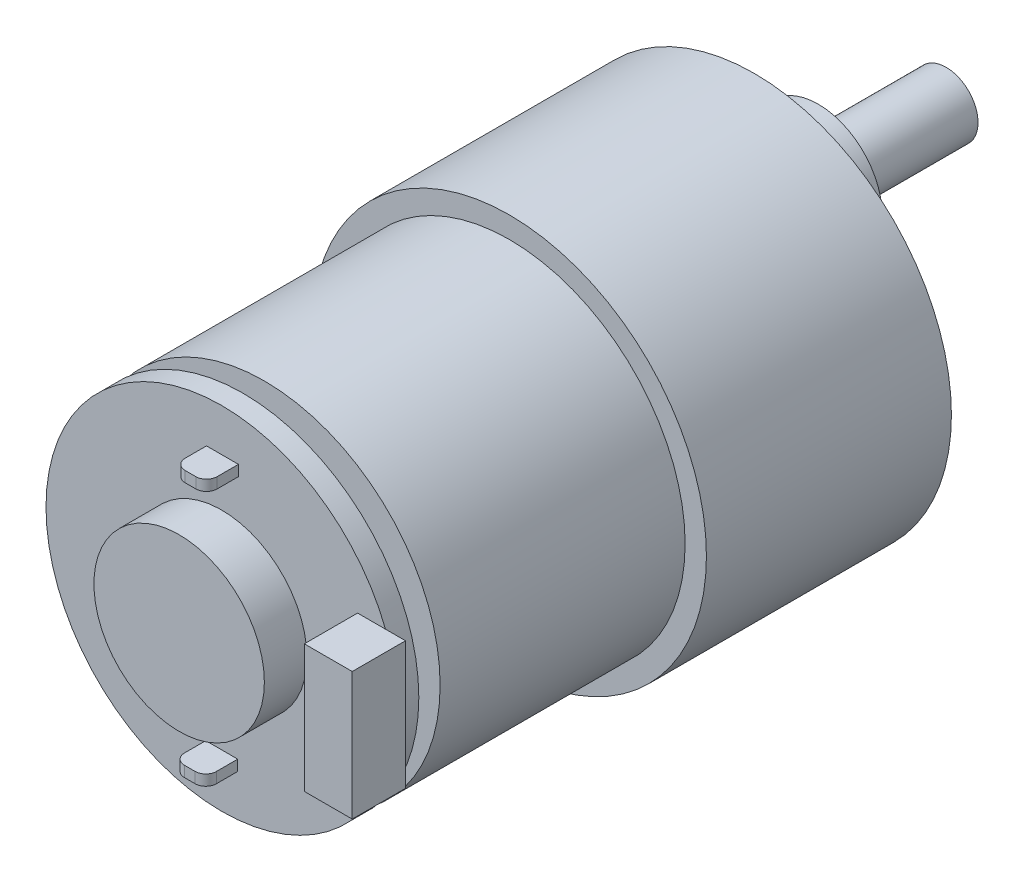
ISO-10303-21;
HEADER;
FILE_DESCRIPTION(('STEP AP214'),'2;1');
FILE_NAME('part.step','',(''),(''),'','','');
FILE_SCHEMA(('AUTOMOTIVE_DESIGN { 1 0 10303 214 1 1 1 1 }'));
ENDSEC;
DATA;
#1=APPLICATION_CONTEXT('core data for automotive mechanical design processes');
#2=APPLICATION_PROTOCOL_DEFINITION('international standard','automotive_design',2000,#1);
#3=PRODUCT_CONTEXT('',#1,'mechanical');
#4=PRODUCT('Part','Part','',(#3));
#5=PRODUCT_RELATED_PRODUCT_CATEGORY('part','',(#4));
#6=PRODUCT_DEFINITION_FORMATION('','',#4);
#7=PRODUCT_DEFINITION_CONTEXT('part definition',#1,'design');
#8=PRODUCT_DEFINITION('design','',#6,#7);
#9=PRODUCT_DEFINITION_SHAPE('','',#8);
#10=(LENGTH_UNIT() NAMED_UNIT(*) SI_UNIT(.MILLI.,.METRE.));
#11=(NAMED_UNIT(*) PLANE_ANGLE_UNIT() SI_UNIT($,.RADIAN.));
#12=(NAMED_UNIT(*) SI_UNIT($,.STERADIAN.) SOLID_ANGLE_UNIT());
#13=UNCERTAINTY_MEASURE_WITH_UNIT(LENGTH_MEASURE(1.E-05),#10,'distance_accuracy_value','');
#14=(GEOMETRIC_REPRESENTATION_CONTEXT(3) GLOBAL_UNCERTAINTY_ASSIGNED_CONTEXT((#13)) GLOBAL_UNIT_ASSIGNED_CONTEXT((#10,
#11,#12)) REPRESENTATION_CONTEXT('',''));
#15=CARTESIAN_POINT('',(0.,0.,0.));
#16=DIRECTION('',(0.,0.,1.));
#17=DIRECTION('',(1.,0.,0.));
#18=AXIS2_PLACEMENT_3D('',#15,#16,#17);
#19=CARTESIAN_POINT('',(0.,0.,50.));
#20=DIRECTION('',(0.,0.,1.));
#21=DIRECTION('',(1.,0.,0.));
#22=AXIS2_PLACEMENT_3D('',#19,#20,#21);
#23=PLANE('',#22);
#24=CARTESIAN_POINT('',(0.,0.,50.));
#25=DIRECTION('',(0.,0.,1.));
#26=DIRECTION('',(1.,0.,0.));
#27=AXIS2_PLACEMENT_3D('',#24,#25,#26);
#28=CIRCLE('',#27,8.);
#29=CARTESIAN_POINT('',(8.,0.,50.));
#30=VERTEX_POINT('',#29);
#31=EDGE_CURVE('E903',#30,#30,#28,.T.);
#32=ORIENTED_EDGE('',*,*,#31,.F.);
#33=EDGE_LOOP('',(#32));
#34=FACE_BOUND('',#33,.T.);
#35=DIRECTION('',(0.,1.,0.));
#36=VECTOR('',#35,1.);
#37=CARTESIAN_POINT('',(1.5,-11.5,50.));
#38=LINE('',#37,#36);
#39=CARTESIAN_POINT('',(1.5,-12.5,50.));
#40=VERTEX_POINT('',#39);
#41=CARTESIAN_POINT('',(1.5,-11.5,50.));
#42=VERTEX_POINT('',#41);
#43=EDGE_CURVE('E267',#40,#42,#38,.T.);
#44=ORIENTED_EDGE('',*,*,#43,.F.);
#45=DIRECTION('',(1.,0.,0.));
#46=VECTOR('',#45,1.);
#47=CARTESIAN_POINT('',(-1.5,-12.5,50.));
#48=LINE('',#47,#46);
#49=CARTESIAN_POINT('',(-1.5,-12.5,50.));
#50=VERTEX_POINT('',#49);
#51=EDGE_CURVE('E375',#50,#40,#48,.T.);
#52=ORIENTED_EDGE('',*,*,#51,.F.);
#53=DIRECTION('',(0.,-1.,0.));
#54=VECTOR('',#53,1.);
#55=CARTESIAN_POINT('',(-1.5,-11.5,50.));
#56=LINE('',#55,#54);
#57=CARTESIAN_POINT('',(-1.5,-11.5,50.));
#58=VERTEX_POINT('',#57);
#59=EDGE_CURVE('E261',#58,#50,#56,.T.);
#60=ORIENTED_EDGE('',*,*,#59,.F.);
#61=DIRECTION('',(-1.,0.,0.));
#62=VECTOR('',#61,1.);
#63=CARTESIAN_POINT('',(-1.5,-11.5,50.));
#64=LINE('',#63,#62);
#65=EDGE_CURVE('E264',#42,#58,#64,.T.);
#66=ORIENTED_EDGE('',*,*,#65,.F.);
#67=EDGE_LOOP('',(#44,#52,#60,#66));
#68=FACE_BOUND('',#67,.T.);
#69=DIRECTION('',(0.,1.,0.));
#70=VECTOR('',#69,1.);
#71=CARTESIAN_POINT('',(1.56650922654028,12.5,50.));
#72=LINE('',#71,#70);
#73=CARTESIAN_POINT('',(1.56650922654028,11.5,50.));
#74=VERTEX_POINT('',#73);
#75=CARTESIAN_POINT('',(1.56650922654028,12.5,50.));
#76=VERTEX_POINT('',#75);
#77=EDGE_CURVE('E279',#74,#76,#72,.T.);
#78=ORIENTED_EDGE('',*,*,#77,.F.);
#79=DIRECTION('',(1.,0.,0.));
#80=VECTOR('',#79,1.);
#81=CARTESIAN_POINT('',(-1.43349077345972,11.5,50.));
#82=LINE('',#81,#80);
#83=CARTESIAN_POINT('',(-1.43349077345972,11.5,50.));
#84=VERTEX_POINT('',#83);
#85=EDGE_CURVE('E270',#84,#74,#82,.T.);
#86=ORIENTED_EDGE('',*,*,#85,.F.);
#87=DIRECTION('',(0.,-1.,0.));
#88=VECTOR('',#87,1.);
#89=CARTESIAN_POINT('',(-1.43349077345972,12.5,50.));
#90=LINE('',#89,#88);
#91=CARTESIAN_POINT('',(-1.43349077345972,12.5,50.));
#92=VERTEX_POINT('',#91);
#93=EDGE_CURVE('E273',#92,#84,#90,.T.);
#94=ORIENTED_EDGE('',*,*,#93,.F.);
#95=DIRECTION('',(-1.,0.,0.));
#96=VECTOR('',#95,1.);
#97=CARTESIAN_POINT('',(-1.43349077345972,12.5,50.));
#98=LINE('',#97,#96);
#99=EDGE_CURVE('E276',#76,#92,#98,.T.);
#100=ORIENTED_EDGE('',*,*,#99,.F.);
#101=EDGE_LOOP('',(#78,#86,#94,#100));
#102=FACE_BOUND('',#101,.T.);
#103=DIRECTION('',(0.,-1.,0.));
#104=VECTOR('',#103,1.);
#105=CARTESIAN_POINT('',(12.75,6.,50.));
#106=LINE('',#105,#104);
#107=CARTESIAN_POINT('',(12.75,6.,50.));
#108=VERTEX_POINT('',#107);
#109=CARTESIAN_POINT('',(12.75,-6.,50.));
#110=VERTEX_POINT('',#109);
#111=EDGE_CURVE('E886',#108,#110,#106,.T.);
#112=ORIENTED_EDGE('',*,*,#111,.F.);
#113=DIRECTION('',(-1.,0.,0.));
#114=VECTOR('',#113,1.);
#115=CARTESIAN_POINT('',(12.75,6.,50.));
#116=LINE('',#115,#114);
#117=CARTESIAN_POINT('',(15.3704261489394,6.,50.));
#118=VERTEX_POINT('',#117);
#119=EDGE_CURVE('E898',#118,#108,#116,.T.);
#120=ORIENTED_EDGE('',*,*,#119,.F.);
#121=CARTESIAN_POINT('',(0.,0.,50.));
#122=DIRECTION('',(0.,0.,1.));
#123=DIRECTION('',(1.,0.,0.));
#124=AXIS2_PLACEMENT_3D('',#121,#122,#123);
#125=CIRCLE('',#124,16.5);
#126=CARTESIAN_POINT('',(15.3704261489394,-6.,50.));
#127=VERTEX_POINT('',#126);
#128=EDGE_CURVE('E237',#118,#127,#125,.T.);
#129=ORIENTED_EDGE('',*,*,#128,.T.);
#130=DIRECTION('',(1.,0.,0.));
#131=VECTOR('',#130,1.);
#132=CARTESIAN_POINT('',(12.75,-6.,50.));
#133=LINE('',#132,#131);
#134=EDGE_CURVE('E223',#110,#127,#133,.T.);
#135=ORIENTED_EDGE('',*,*,#134,.F.);
#136=EDGE_LOOP('',(#112,#120,#129,#135));
#137=FACE_BOUND('',#136,.T.);
#138=ADVANCED_FACE('F34',(#34,#68,#102,#137),#23,.T.);
#139=CARTESIAN_POINT('',(1.56650922654028,12.5,53.));
#140=DIRECTION('',(-1.,0.,0.));
#141=DIRECTION('',(0.,-1.,0.));
#142=AXIS2_PLACEMENT_3D('',#139,#140,#141);
#143=PLANE('',#142);
#144=DIRECTION('',(0.,1.,0.));
#145=VECTOR('',#144,1.);
#146=CARTESIAN_POINT('',(1.56650922654028,12.5,48.));
#147=LINE('',#146,#145);
#148=CARTESIAN_POINT('',(1.56650922654028,11.5,48.));
#149=VERTEX_POINT('',#148);
#150=CARTESIAN_POINT('',(1.56650922654028,12.5,48.));
#151=VERTEX_POINT('',#150);
#152=EDGE_CURVE('E258',#149,#151,#147,.T.);
#153=ORIENTED_EDGE('',*,*,#152,.F.);
#154=DIRECTION('',(0.,0.,-1.));
#155=VECTOR('',#154,1.);
#156=CARTESIAN_POINT('',(1.56650922654028,11.5,53.));
#157=LINE('',#156,#155);
#158=CARTESIAN_POINT('',(1.56650922654028,11.5,46.));
#159=VERTEX_POINT('',#158);
#160=EDGE_CURVE('E320',#149,#159,#157,.T.);
#161=ORIENTED_EDGE('',*,*,#160,.T.);
#162=DIRECTION('',(0.,1.,0.));
#163=VECTOR('',#162,1.);
#164=CARTESIAN_POINT('',(1.56650922654028,12.5,46.));
#165=LINE('',#164,#163);
#166=CARTESIAN_POINT('',(1.56650922654028,12.5,46.));
#167=VERTEX_POINT('',#166);
#168=EDGE_CURVE('E312',#159,#167,#165,.T.);
#169=ORIENTED_EDGE('',*,*,#168,.T.);
#170=DIRECTION('',(0.,0.,-1.));
#171=VECTOR('',#170,1.);
#172=CARTESIAN_POINT('',(1.56650922654028,12.5,53.));
#173=LINE('',#172,#171);
#174=EDGE_CURVE('E339',#151,#167,#173,.T.);
#175=ORIENTED_EDGE('',*,*,#174,.F.);
#176=EDGE_LOOP('',(#153,#161,#169,#175));
#177=FACE_BOUND('',#176,.T.);
#178=ADVANCED_FACE('F442',(#177),#143,.F.);
#179=CARTESIAN_POINT('',(-1.43349077345972,12.5,53.));
#180=DIRECTION('',(0.,-1.,0.));
#181=DIRECTION('',(0.,0.,-1.));
#182=AXIS2_PLACEMENT_3D('',#179,#180,#181);
#183=PLANE('',#182);
#184=DIRECTION('',(-1.,0.,0.));
#185=VECTOR('',#184,1.);
#186=CARTESIAN_POINT('',(-1.43349077345972,12.5,48.));
#187=LINE('',#186,#185);
#188=CARTESIAN_POINT('',(-1.43349077345972,12.5,48.));
#189=VERTEX_POINT('',#188);
#190=EDGE_CURVE('E255',#151,#189,#187,.T.);
#191=ORIENTED_EDGE('',*,*,#190,.F.);
#192=ORIENTED_EDGE('',*,*,#174,.T.);
#193=DIRECTION('',(-1.,0.,0.));
#194=VECTOR('',#193,1.);
#195=CARTESIAN_POINT('',(-1.43349077345972,12.5,46.));
#196=LINE('',#195,#194);
#197=CARTESIAN_POINT('',(-1.43349077345972,12.5,46.));
#198=VERTEX_POINT('',#197);
#199=EDGE_CURVE('E323',#167,#198,#196,.T.);
#200=ORIENTED_EDGE('',*,*,#199,.T.);
#201=DIRECTION('',(0.,0.,-1.));
#202=VECTOR('',#201,1.);
#203=CARTESIAN_POINT('',(-1.43349077345972,12.5,53.));
#204=LINE('',#203,#202);
#205=EDGE_CURVE('E336',#189,#198,#204,.T.);
#206=ORIENTED_EDGE('',*,*,#205,.F.);
#207=EDGE_LOOP('',(#191,#192,#200,#206));
#208=FACE_BOUND('',#207,.T.);
#209=ADVANCED_FACE('F448',(#208),#183,.F.);
#210=CARTESIAN_POINT('',(-1.43349077345972,12.5,53.));
#211=DIRECTION('',(1.,0.,0.));
#212=DIRECTION('',(0.,1.,0.));
#213=AXIS2_PLACEMENT_3D('',#210,#211,#212);
#214=PLANE('',#213);
#215=DIRECTION('',(0.,-1.,0.));
#216=VECTOR('',#215,1.);
#217=CARTESIAN_POINT('',(-1.43349077345972,12.5,48.));
#218=LINE('',#217,#216);
#219=CARTESIAN_POINT('',(-1.43349077345972,11.5,48.));
#220=VERTEX_POINT('',#219);
#221=EDGE_CURVE('E252',#189,#220,#218,.T.);
#222=ORIENTED_EDGE('',*,*,#221,.F.);
#223=ORIENTED_EDGE('',*,*,#205,.T.);
#224=DIRECTION('',(0.,-1.,0.));
#225=VECTOR('',#224,1.);
#226=CARTESIAN_POINT('',(-1.43349077345972,12.5,46.));
#227=LINE('',#226,#225);
#228=CARTESIAN_POINT('',(-1.43349077345972,11.5,46.));
#229=VERTEX_POINT('',#228);
#230=EDGE_CURVE('E326',#198,#229,#227,.T.);
#231=ORIENTED_EDGE('',*,*,#230,.T.);
#232=DIRECTION('',(0.,0.,-1.));
#233=VECTOR('',#232,1.);
#234=CARTESIAN_POINT('',(-1.43349077345972,11.5,53.));
#235=LINE('',#234,#233);
#236=EDGE_CURVE('E333',#220,#229,#235,.T.);
#237=ORIENTED_EDGE('',*,*,#236,.F.);
#238=EDGE_LOOP('',(#222,#223,#231,#237));
#239=FACE_BOUND('',#238,.T.);
#240=ADVANCED_FACE('F496',(#239),#214,.F.);
#241=CARTESIAN_POINT('',(-1.43349077345972,11.5,53.));
#242=DIRECTION('',(0.,1.,0.));
#243=DIRECTION('',(0.,0.,1.));
#244=AXIS2_PLACEMENT_3D('',#241,#242,#243);
#245=PLANE('',#244);
#246=DIRECTION('',(1.,0.,0.));
#247=VECTOR('',#246,1.);
#248=CARTESIAN_POINT('',(-1.43349077345972,11.5,48.));
#249=LINE('',#248,#247);
#250=EDGE_CURVE('E249',#220,#149,#249,.T.);
#251=ORIENTED_EDGE('',*,*,#250,.F.);
#252=ORIENTED_EDGE('',*,*,#236,.T.);
#253=DIRECTION('',(1.,0.,0.));
#254=VECTOR('',#253,1.);
#255=CARTESIAN_POINT('',(-1.43349077345972,11.5,46.));
#256=LINE('',#255,#254);
#257=EDGE_CURVE('E317',#229,#159,#256,.T.);
#258=ORIENTED_EDGE('',*,*,#257,.T.);
#259=ORIENTED_EDGE('',*,*,#160,.F.);
#260=EDGE_LOOP('',(#251,#252,#258,#259));
#261=FACE_BOUND('',#260,.T.);
#262=ADVANCED_FACE('F493',(#261),#245,.F.);
#263=CARTESIAN_POINT('',(1.5,-11.5,53.));
#264=DIRECTION('',(-1.,0.,0.));
#265=DIRECTION('',(0.,-1.,0.));
#266=AXIS2_PLACEMENT_3D('',#263,#264,#265);
#267=PLANE('',#266);
#268=DIRECTION('',(0.,1.,0.));
#269=VECTOR('',#268,1.);
#270=CARTESIAN_POINT('',(1.5,-11.5,48.));
#271=LINE('',#270,#269);
#272=CARTESIAN_POINT('',(1.5,-12.5,48.));
#273=VERTEX_POINT('',#272);
#274=CARTESIAN_POINT('',(1.5,-11.5,48.));
#275=VERTEX_POINT('',#274);
#276=EDGE_CURVE('E246',#273,#275,#271,.T.);
#277=ORIENTED_EDGE('',*,*,#276,.F.);
#278=DIRECTION('',(0.,0.,-1.));
#279=VECTOR('',#278,1.);
#280=CARTESIAN_POINT('',(1.5,-12.5,53.));
#281=LINE('',#280,#279);
#282=CARTESIAN_POINT('',(1.5,-12.5,46.));
#283=VERTEX_POINT('',#282);
#284=EDGE_CURVE('E290',#273,#283,#281,.T.);
#285=ORIENTED_EDGE('',*,*,#284,.T.);
#286=DIRECTION('',(0.,1.,0.));
#287=VECTOR('',#286,1.);
#288=CARTESIAN_POINT('',(1.5,-11.5,46.));
#289=LINE('',#288,#287);
#290=CARTESIAN_POINT('',(1.5,-11.5,46.));
#291=VERTEX_POINT('',#290);
#292=EDGE_CURVE('E282',#283,#291,#289,.T.);
#293=ORIENTED_EDGE('',*,*,#292,.T.);
#294=DIRECTION('',(0.,0.,-1.));
#295=VECTOR('',#294,1.);
#296=CARTESIAN_POINT('',(1.5,-11.5,53.));
#297=LINE('',#296,#295);
#298=EDGE_CURVE('E309',#275,#291,#297,.T.);
#299=ORIENTED_EDGE('',*,*,#298,.F.);
#300=EDGE_LOOP('',(#277,#285,#293,#299));
#301=FACE_BOUND('',#300,.T.);
#302=ADVANCED_FACE('F488',(#301),#267,.F.);
#303=CARTESIAN_POINT('',(-1.5,-11.5,53.));
#304=DIRECTION('',(0.,-1.,0.));
#305=DIRECTION('',(0.,0.,-1.));
#306=AXIS2_PLACEMENT_3D('',#303,#304,#305);
#307=PLANE('',#306);
#308=DIRECTION('',(-1.,0.,0.));
#309=VECTOR('',#308,1.);
#310=CARTESIAN_POINT('',(-1.5,-11.5,48.));
#311=LINE('',#310,#309);
#312=CARTESIAN_POINT('',(-1.5,-11.5,48.));
#313=VERTEX_POINT('',#312);
#314=EDGE_CURVE('E243',#275,#313,#311,.T.);
#315=ORIENTED_EDGE('',*,*,#314,.F.);
#316=ORIENTED_EDGE('',*,*,#298,.T.);
#317=DIRECTION('',(-1.,0.,0.));
#318=VECTOR('',#317,1.);
#319=CARTESIAN_POINT('',(-1.5,-11.5,46.));
#320=LINE('',#319,#318);
#321=CARTESIAN_POINT('',(-1.5,-11.5,46.));
#322=VERTEX_POINT('',#321);
#323=EDGE_CURVE('E293',#291,#322,#320,.T.);
#324=ORIENTED_EDGE('',*,*,#323,.T.);
#325=DIRECTION('',(0.,0.,-1.));
#326=VECTOR('',#325,1.);
#327=CARTESIAN_POINT('',(-1.5,-11.5,53.));
#328=LINE('',#327,#326);
#329=EDGE_CURVE('E306',#313,#322,#328,.T.);
#330=ORIENTED_EDGE('',*,*,#329,.F.);
#331=EDGE_LOOP('',(#315,#316,#324,#330));
#332=FACE_BOUND('',#331,.T.);
#333=ADVANCED_FACE('F484',(#332),#307,.F.);
#334=CARTESIAN_POINT('',(-1.5,-11.5,53.));
#335=DIRECTION('',(1.,0.,0.));
#336=DIRECTION('',(0.,1.,0.));
#337=AXIS2_PLACEMENT_3D('',#334,#335,#336);
#338=PLANE('',#337);
#339=DIRECTION('',(0.,-1.,0.));
#340=VECTOR('',#339,1.);
#341=CARTESIAN_POINT('',(-1.5,-11.5,48.));
#342=LINE('',#341,#340);
#343=CARTESIAN_POINT('',(-1.5,-12.5,48.));
#344=VERTEX_POINT('',#343);
#345=EDGE_CURVE('E239',#313,#344,#342,.T.);
#346=ORIENTED_EDGE('',*,*,#345,.F.);
#347=ORIENTED_EDGE('',*,*,#329,.T.);
#348=DIRECTION('',(0.,-1.,0.));
#349=VECTOR('',#348,1.);
#350=CARTESIAN_POINT('',(-1.5,-11.5,46.));
#351=LINE('',#350,#349);
#352=CARTESIAN_POINT('',(-1.5,-12.5,46.));
#353=VERTEX_POINT('',#352);
#354=EDGE_CURVE('E296',#322,#353,#351,.T.);
#355=ORIENTED_EDGE('',*,*,#354,.T.);
#356=DIRECTION('',(0.,0.,-1.));
#357=VECTOR('',#356,1.);
#358=CARTESIAN_POINT('',(-1.5,-12.5,53.));
#359=LINE('',#358,#357);
#360=EDGE_CURVE('E303',#344,#353,#359,.T.);
#361=ORIENTED_EDGE('',*,*,#360,.F.);
#362=EDGE_LOOP('',(#346,#347,#355,#361));
#363=FACE_BOUND('',#362,.T.);
#364=ADVANCED_FACE('F479',(#363),#338,.F.);
#365=CARTESIAN_POINT('',(-1.5,-12.5,53.));
#366=DIRECTION('',(0.,1.,0.));
#367=DIRECTION('',(0.,0.,1.));
#368=AXIS2_PLACEMENT_3D('',#365,#366,#367);
#369=PLANE('',#368);
#370=DIRECTION('',(1.,0.,0.));
#371=VECTOR('',#370,1.);
#372=CARTESIAN_POINT('',(-1.5,-12.5,48.));
#373=LINE('',#372,#371);
#374=EDGE_CURVE('E355',#344,#273,#373,.T.);
#375=ORIENTED_EDGE('',*,*,#374,.F.);
#376=ORIENTED_EDGE('',*,*,#360,.T.);
#377=DIRECTION('',(1.,0.,0.));
#378=VECTOR('',#377,1.);
#379=CARTESIAN_POINT('',(-1.5,-12.5,46.));
#380=LINE('',#379,#378);
#381=EDGE_CURVE('E287',#353,#283,#380,.T.);
#382=ORIENTED_EDGE('',*,*,#381,.T.);
#383=ORIENTED_EDGE('',*,*,#284,.F.);
#384=EDGE_LOOP('',(#375,#376,#382,#383));
#385=FACE_BOUND('',#384,.T.);
#386=ADVANCED_FACE('F474',(#385),#369,.F.);
#387=CARTESIAN_POINT('',(0.,0.,46.));
#388=DIRECTION('',(0.,0.,1.));
#389=DIRECTION('',(1.,0.,0.));
#390=AXIS2_PLACEMENT_3D('',#387,#388,#389);
#391=PLANE('',#390);
#392=CARTESIAN_POINT('',(0.,0.,46.));
#393=DIRECTION('',(0.,0.,1.));
#394=DIRECTION('',(1.,0.,0.));
#395=AXIS2_PLACEMENT_3D('',#392,#393,#394);
#396=CIRCLE('',#395,2.);
#397=CARTESIAN_POINT('',(2.,0.,46.));
#398=VERTEX_POINT('',#397);
#399=EDGE_CURVE('E342',#398,#398,#396,.T.);
#400=ORIENTED_EDGE('',*,*,#399,.F.);
#401=EDGE_LOOP('',(#400));
#402=FACE_BOUND('',#401,.T.);
#403=CARTESIAN_POINT('',(0.,0.,46.));
#404=DIRECTION('',(0.,0.,1.));
#405=DIRECTION('',(1.,0.,0.));
#406=AXIS2_PLACEMENT_3D('',#403,#404,#405);
#407=CIRCLE('',#406,16.5);
#408=CARTESIAN_POINT('',(16.5,0.,46.));
#409=VERTEX_POINT('',#408);
#410=EDGE_CURVE('E359',#409,#409,#407,.T.);
#411=ORIENTED_EDGE('',*,*,#410,.T.);
#412=EDGE_LOOP('',(#411));
#413=FACE_BOUND('',#412,.T.);
#414=ORIENTED_EDGE('',*,*,#199,.F.);
#415=ORIENTED_EDGE('',*,*,#168,.F.);
#416=ORIENTED_EDGE('',*,*,#257,.F.);
#417=ORIENTED_EDGE('',*,*,#230,.F.);
#418=EDGE_LOOP('',(#414,#415,#416,#417));
#419=FACE_BOUND('',#418,.T.);
#420=ORIENTED_EDGE('',*,*,#323,.F.);
#421=ORIENTED_EDGE('',*,*,#292,.F.);
#422=ORIENTED_EDGE('',*,*,#381,.F.);
#423=ORIENTED_EDGE('',*,*,#354,.F.);
#424=EDGE_LOOP('',(#420,#421,#422,#423));
#425=FACE_BOUND('',#424,.T.);
#426=ADVANCED_FACE('F520',(#402,#413,#419,#425),#391,.T.);
#427=CARTESIAN_POINT('',(0.,0.,23.));
#428=DIRECTION('',(0.,0.,-1.));
#429=DIRECTION('',(-1.,0.,0.));
#430=AXIS2_PLACEMENT_3D('',#427,#428,#429);
#431=CYLINDRICAL_SURFACE('',#430,18.5);
#432=CARTESIAN_POINT('',(0.,0.,23.));
#433=DIRECTION('',(0.,0.,1.));
#434=DIRECTION('',(1.,0.,0.));
#435=AXIS2_PLACEMENT_3D('',#432,#433,#434);
#436=CIRCLE('',#435,18.5);
#437=CARTESIAN_POINT('',(18.5,0.,23.));
#438=VERTEX_POINT('',#437);
#439=EDGE_CURVE('E366',#438,#438,#436,.T.);
#440=ORIENTED_EDGE('',*,*,#439,.F.);
#441=EDGE_LOOP('',(#440));
#442=FACE_BOUND('',#441,.T.);
#443=CARTESIAN_POINT('',(0.,0.,0.));
#444=DIRECTION('',(0.,0.,1.));
#445=DIRECTION('',(1.,0.,0.));
#446=AXIS2_PLACEMENT_3D('',#443,#444,#445);
#447=CIRCLE('',#446,18.5);
#448=CARTESIAN_POINT('',(18.5,0.,0.));
#449=VERTEX_POINT('',#448);
#450=EDGE_CURVE('E362',#449,#449,#447,.T.);
#451=ORIENTED_EDGE('',*,*,#450,.T.);
#452=EDGE_LOOP('',(#451));
#453=FACE_BOUND('',#452,.T.);
#454=ADVANCED_FACE('F523',(#442,#453),#431,.T.);
#455=CARTESIAN_POINT('',(0.,0.,23.));
#456=DIRECTION('',(0.,0.,1.));
#457=DIRECTION('',(1.,0.,0.));
#458=AXIS2_PLACEMENT_3D('',#455,#456,#457);
#459=PLANE('',#458);
#460=CARTESIAN_POINT('',(0.,0.,23.));
#461=DIRECTION('',(0.,0.,1.));
#462=DIRECTION('',(1.,0.,0.));
#463=AXIS2_PLACEMENT_3D('',#460,#461,#462);
#464=CIRCLE('',#463,16.5);
#465=CARTESIAN_POINT('',(16.5,0.,23.));
#466=VERTEX_POINT('',#465);
#467=EDGE_CURVE('E363',#466,#466,#464,.T.);
#468=ORIENTED_EDGE('',*,*,#467,.F.);
#469=EDGE_LOOP('',(#468));
#470=FACE_BOUND('',#469,.T.);
#471=ORIENTED_EDGE('',*,*,#439,.T.);
#472=EDGE_LOOP('',(#471));
#473=FACE_BOUND('',#472,.T.);
#474=ADVANCED_FACE('F529',(#470,#473),#459,.T.);
#475=CARTESIAN_POINT('',(0.,0.,0.));
#476=DIRECTION('',(0.,0.,1.));
#477=DIRECTION('',(1.,0.,0.));
#478=AXIS2_PLACEMENT_3D('',#475,#476,#477);
#479=PLANE('',#478);
#480=CARTESIAN_POINT('',(0.,7.,0.));
#481=DIRECTION('',(0.,0.,1.));
#482=DIRECTION('',(1.,0.,0.));
#483=AXIS2_PLACEMENT_3D('',#480,#481,#482);
#484=CIRCLE('',#483,6.);
#485=CARTESIAN_POINT('',(6.,7.,0.));
#486=VERTEX_POINT('',#485);
#487=EDGE_CURVE('E356',#486,#486,#484,.F.);
#488=ORIENTED_EDGE('',*,*,#487,.F.);
#489=EDGE_LOOP('',(#488));
#490=FACE_BOUND('',#489,.T.);
#491=ORIENTED_EDGE('',*,*,#450,.F.);
#492=EDGE_LOOP('',(#491));
#493=FACE_BOUND('',#492,.T.);
#494=ADVANCED_FACE('F527',(#490,#493),#479,.F.);
#495=CARTESIAN_POINT('',(0.,0.,46.));
#496=DIRECTION('',(0.,0.,-1.));
#497=DIRECTION('',(-1.,0.,0.));
#498=AXIS2_PLACEMENT_3D('',#495,#496,#497);
#499=CYLINDRICAL_SURFACE('',#498,16.5);
#500=ORIENTED_EDGE('',*,*,#410,.F.);
#501=EDGE_LOOP('',(#500));
#502=FACE_BOUND('',#501,.T.);
#503=ORIENTED_EDGE('',*,*,#467,.T.);
#504=EDGE_LOOP('',(#503));
#505=FACE_BOUND('',#504,.T.);
#506=ADVANCED_FACE('F518',(#502,#505),#499,.T.);
#507=CARTESIAN_POINT('',(0.,7.,-6.));
#508=DIRECTION('',(0.,0.,1.));
#509=DIRECTION('',(1.,0.,0.));
#510=AXIS2_PLACEMENT_3D('',#507,#508,#509);
#511=CYLINDRICAL_SURFACE('',#510,6.);
#512=CARTESIAN_POINT('',(0.,7.,-6.));
#513=DIRECTION('',(0.,0.,-1.));
#514=DIRECTION('',(-1.,0.,0.));
#515=AXIS2_PLACEMENT_3D('',#512,#513,#514);
#516=CIRCLE('',#515,6.);
#517=CARTESIAN_POINT('',(-6.,7.,-6.));
#518=VERTEX_POINT('',#517);
#519=EDGE_CURVE('E351',#518,#518,#516,.T.);
#520=ORIENTED_EDGE('',*,*,#519,.F.);
#521=EDGE_LOOP('',(#520));
#522=FACE_BOUND('',#521,.T.);
#523=ORIENTED_EDGE('',*,*,#487,.T.);
#524=EDGE_LOOP('',(#523));
#525=FACE_BOUND('',#524,.T.);
#526=ADVANCED_FACE('F514',(#522,#525),#511,.T.);
#527=CARTESIAN_POINT('',(0.,7.,-6.));
#528=DIRECTION('',(0.,0.,-1.));
#529=DIRECTION('',(-1.,0.,0.));
#530=AXIS2_PLACEMENT_3D('',#527,#528,#529);
#531=PLANE('',#530);
#532=CARTESIAN_POINT('',(0.,7.,-6.));
#533=DIRECTION('',(0.,0.,-1.));
#534=DIRECTION('',(-1.,0.,0.));
#535=AXIS2_PLACEMENT_3D('',#532,#533,#534);
#536=CIRCLE('',#535,3.);
#537=CARTESIAN_POINT('',(-3.,7.,-6.));
#538=VERTEX_POINT('',#537);
#539=EDGE_CURVE('E352',#538,#538,#536,.T.);
#540=ORIENTED_EDGE('',*,*,#539,.F.);
#541=EDGE_LOOP('',(#540));
#542=FACE_BOUND('',#541,.T.);
#543=ORIENTED_EDGE('',*,*,#519,.T.);
#544=EDGE_LOOP('',(#543));
#545=FACE_BOUND('',#544,.T.);
#546=ADVANCED_FACE('F510',(#542,#545),#531,.T.);
#547=CARTESIAN_POINT('',(0.,7.,-18.));
#548=DIRECTION('',(0.,0.,1.));
#549=DIRECTION('',(1.,0.,0.));
#550=AXIS2_PLACEMENT_3D('',#547,#548,#549);
#551=CYLINDRICAL_SURFACE('',#550,3.);
#552=CARTESIAN_POINT('',(0.,7.,-18.));
#553=DIRECTION('',(0.,0.,-1.));
#554=DIRECTION('',(-1.,0.,0.));
#555=AXIS2_PLACEMENT_3D('',#552,#553,#554);
#556=CIRCLE('',#555,3.);
#557=CARTESIAN_POINT('',(-3.,7.,-18.));
#558=VERTEX_POINT('',#557);
#559=EDGE_CURVE('E346',#558,#558,#556,.T.);
#560=ORIENTED_EDGE('',*,*,#559,.F.);
#561=EDGE_LOOP('',(#560));
#562=FACE_BOUND('',#561,.T.);
#563=ORIENTED_EDGE('',*,*,#539,.T.);
#564=EDGE_LOOP('',(#563));
#565=FACE_BOUND('',#564,.T.);
#566=ADVANCED_FACE('F506',(#562,#565),#551,.T.);
#567=CARTESIAN_POINT('',(0.,7.,-18.));
#568=DIRECTION('',(0.,0.,-1.));
#569=DIRECTION('',(-1.,0.,0.));
#570=AXIS2_PLACEMENT_3D('',#567,#568,#569);
#571=PLANE('',#570);
#572=ORIENTED_EDGE('',*,*,#559,.T.);
#573=EDGE_LOOP('',(#572));
#574=FACE_BOUND('',#573,.T.);
#575=ADVANCED_FACE('F502',(#574),#571,.T.);
#576=CARTESIAN_POINT('',(0.,0.,48.));
#577=DIRECTION('',(0.,0.,-1.));
#578=DIRECTION('',(-1.,0.,0.));
#579=AXIS2_PLACEMENT_3D('',#576,#577,#578);
#580=CYLINDRICAL_SURFACE('',#579,2.);
#581=CARTESIAN_POINT('',(0.,0.,48.));
#582=DIRECTION('',(0.,0.,1.));
#583=DIRECTION('',(1.,0.,0.));
#584=AXIS2_PLACEMENT_3D('',#581,#582,#583);
#585=CIRCLE('',#584,2.);
#586=CARTESIAN_POINT('',(2.,0.,48.));
#587=VERTEX_POINT('',#586);
#588=EDGE_CURVE('E343',#587,#587,#585,.T.);
#589=ORIENTED_EDGE('',*,*,#588,.F.);
#590=EDGE_LOOP('',(#589));
#591=FACE_BOUND('',#590,.T.);
#592=ORIENTED_EDGE('',*,*,#399,.T.);
#593=EDGE_LOOP('',(#592));
#594=FACE_BOUND('',#593,.T.);
#595=ADVANCED_FACE('F460',(#591,#594),#580,.T.);
#596=CARTESIAN_POINT('',(0.,0.,48.));
#597=DIRECTION('',(0.,0.,1.));
#598=DIRECTION('',(1.,0.,0.));
#599=AXIS2_PLACEMENT_3D('',#596,#597,#598);
#600=PLANE('',#599);
#601=ORIENTED_EDGE('',*,*,#250,.T.);
#602=ORIENTED_EDGE('',*,*,#152,.T.);
#603=ORIENTED_EDGE('',*,*,#190,.T.);
#604=ORIENTED_EDGE('',*,*,#221,.T.);
#605=EDGE_LOOP('',(#601,#602,#603,#604));
#606=FACE_BOUND('',#605,.T.);
#607=ORIENTED_EDGE('',*,*,#374,.T.);
#608=ORIENTED_EDGE('',*,*,#276,.T.);
#609=ORIENTED_EDGE('',*,*,#314,.T.);
#610=ORIENTED_EDGE('',*,*,#345,.T.);
#611=EDGE_LOOP('',(#607,#608,#609,#610));
#612=FACE_BOUND('',#611,.T.);
#613=CARTESIAN_POINT('',(0.,0.,48.));
#614=DIRECTION('',(0.,0.,1.));
#615=DIRECTION('',(1.,0.,0.));
#616=AXIS2_PLACEMENT_3D('',#613,#614,#615);
#617=CIRCLE('',#616,16.5);
#618=CARTESIAN_POINT('',(16.5,0.,48.));
#619=VERTEX_POINT('',#618);
#620=EDGE_CURVE('E228',#619,#619,#617,.T.);
#621=ORIENTED_EDGE('',*,*,#620,.F.);
#622=EDGE_LOOP('',(#621));
#623=FACE_BOUND('',#622,.T.);
#624=ORIENTED_EDGE('',*,*,#588,.T.);
#625=EDGE_LOOP('',(#624));
#626=FACE_BOUND('',#625,.T.);
#627=ADVANCED_FACE('F456',(#606,#612,#623,#626),#600,.F.);
#628=CARTESIAN_POINT('',(0.,0.,50.));
#629=DIRECTION('',(0.,0.,-1.));
#630=DIRECTION('',(-1.,0.,0.));
#631=AXIS2_PLACEMENT_3D('',#628,#629,#630);
#632=CYLINDRICAL_SURFACE('',#631,16.5);
#633=ORIENTED_EDGE('',*,*,#128,.F.);
#634=EDGE_CURVE('E231',#127,#118,#125,.T.);
#635=ORIENTED_EDGE('',*,*,#634,.F.);
#636=EDGE_LOOP('',(#633,#635));
#637=FACE_BOUND('',#636,.T.);
#638=ORIENTED_EDGE('',*,*,#620,.T.);
#639=EDGE_LOOP('',(#638));
#640=FACE_BOUND('',#639,.T.);
#641=ADVANCED_FACE('F459',(#637,#640),#632,.T.);
#642=CARTESIAN_POINT('',(0.,0.,53.));
#643=DIRECTION('',(0.,0.,1.));
#644=DIRECTION('',(1.,0.,0.));
#645=AXIS2_PLACEMENT_3D('',#642,#643,#644);
#646=PLANE('',#645);
#647=DIRECTION('',(-1.,0.,0.));
#648=VECTOR('',#647,1.);
#649=CARTESIAN_POINT('',(-1.5,-11.5,53.));
#650=LINE('',#649,#648);
#651=CARTESIAN_POINT('',(0.5,-11.5,53.));
#652=VERTEX_POINT('',#651);
#653=CARTESIAN_POINT('',(-0.5,-11.5,53.));
#654=VERTEX_POINT('',#653);
#655=EDGE_CURVE('E283',#652,#654,#650,.T.);
#656=ORIENTED_EDGE('',*,*,#655,.T.);
#657=DIRECTION('',(0.,-1.,0.));
#658=VECTOR('',#657,1.);
#659=CARTESIAN_POINT('',(-0.5,-12.5,53.));
#660=LINE('',#659,#658);
#661=CARTESIAN_POINT('',(-0.5,-12.5,53.));
#662=VERTEX_POINT('',#661);
#663=EDGE_CURVE('E381',#654,#662,#660,.T.);
#664=ORIENTED_EDGE('',*,*,#663,.T.);
#665=DIRECTION('',(1.,0.,0.));
#666=VECTOR('',#665,1.);
#667=CARTESIAN_POINT('',(-1.5,-12.5,53.));
#668=LINE('',#667,#666);
#669=CARTESIAN_POINT('',(0.5,-12.5,53.));
#670=VERTEX_POINT('',#669);
#671=EDGE_CURVE('E286',#662,#670,#668,.T.);
#672=ORIENTED_EDGE('',*,*,#671,.T.);
#673=DIRECTION('',(0.,1.,0.));
#674=VECTOR('',#673,1.);
#675=CARTESIAN_POINT('',(0.5,-11.5,53.));
#676=LINE('',#675,#674);
#677=EDGE_CURVE('E378',#670,#652,#676,.T.);
#678=ORIENTED_EDGE('',*,*,#677,.T.);
#679=EDGE_LOOP('',(#656,#664,#672,#678));
#680=FACE_BOUND('',#679,.T.);
#681=ADVANCED_FACE('F464',(#680),#646,.T.);
#682=ORIENTED_EDGE('',*,*,#671,.F.);
#683=CARTESIAN_POINT('',(-0.5,-12.5,52.));
#684=DIRECTION('',(0.,1.,0.));
#685=DIRECTION('',(0.,0.,1.));
#686=AXIS2_PLACEMENT_3D('',#683,#684,#685);
#687=CIRCLE('',#686,1.);
#688=CARTESIAN_POINT('',(-1.5,-12.5,52.));
#689=VERTEX_POINT('',#688);
#690=EDGE_CURVE('E386',#662,#689,#687,.F.);
#691=ORIENTED_EDGE('',*,*,#690,.T.);
#692=EDGE_CURVE('E304',#689,#50,#359,.T.);
#693=ORIENTED_EDGE('',*,*,#692,.T.);
#694=ORIENTED_EDGE('',*,*,#51,.T.);
#695=CARTESIAN_POINT('',(1.5,-12.5,52.));
#696=VERTEX_POINT('',#695);
#697=EDGE_CURVE('E301',#696,#40,#281,.T.);
#698=ORIENTED_EDGE('',*,*,#697,.F.);
#699=CARTESIAN_POINT('',(0.5,-12.5,52.));
#700=DIRECTION('',(0.,1.,0.));
#701=DIRECTION('',(0.,0.,1.));
#702=AXIS2_PLACEMENT_3D('',#699,#700,#701);
#703=CIRCLE('',#702,1.);
#704=EDGE_CURVE('E384',#696,#670,#703,.F.);
#705=ORIENTED_EDGE('',*,*,#704,.T.);
#706=EDGE_LOOP('',(#682,#691,#693,#694,#698,#705));
#707=FACE_BOUND('',#706,.T.);
#708=ADVANCED_FACE('F468',(#707),#369,.F.);
#709=ORIENTED_EDGE('',*,*,#692,.F.);
#710=DIRECTION('',(0.,-1.,0.));
#711=VECTOR('',#710,1.);
#712=CARTESIAN_POINT('',(-1.5,-11.5,52.));
#713=LINE('',#712,#711);
#714=CARTESIAN_POINT('',(-1.5,-11.5,52.));
#715=VERTEX_POINT('',#714);
#716=EDGE_CURVE('E388',#689,#715,#713,.F.);
#717=ORIENTED_EDGE('',*,*,#716,.T.);
#718=EDGE_CURVE('E307',#715,#58,#328,.T.);
#719=ORIENTED_EDGE('',*,*,#718,.T.);
#720=ORIENTED_EDGE('',*,*,#59,.T.);
#721=EDGE_LOOP('',(#709,#717,#719,#720));
#722=FACE_BOUND('',#721,.T.);
#723=ADVANCED_FACE('F472',(#722),#338,.F.);
#724=ORIENTED_EDGE('',*,*,#718,.F.);
#725=CARTESIAN_POINT('',(-0.5,-11.5,52.));
#726=DIRECTION('',(0.,-1.,0.));
#727=DIRECTION('',(0.,0.,-1.));
#728=AXIS2_PLACEMENT_3D('',#725,#726,#727);
#729=CIRCLE('',#728,1.);
#730=EDGE_CURVE('E392',#715,#654,#729,.F.);
#731=ORIENTED_EDGE('',*,*,#730,.T.);
#732=ORIENTED_EDGE('',*,*,#655,.F.);
#733=CARTESIAN_POINT('',(0.5,-11.5,52.));
#734=DIRECTION('',(0.,-1.,0.));
#735=DIRECTION('',(0.,0.,-1.));
#736=AXIS2_PLACEMENT_3D('',#733,#734,#735);
#737=CIRCLE('',#736,1.);
#738=CARTESIAN_POINT('',(1.5,-11.5,52.));
#739=VERTEX_POINT('',#738);
#740=EDGE_CURVE('E390',#652,#739,#737,.F.);
#741=ORIENTED_EDGE('',*,*,#740,.T.);
#742=EDGE_CURVE('E310',#739,#42,#297,.T.);
#743=ORIENTED_EDGE('',*,*,#742,.T.);
#744=ORIENTED_EDGE('',*,*,#65,.T.);
#745=EDGE_LOOP('',(#724,#731,#732,#741,#743,#744));
#746=FACE_BOUND('',#745,.T.);
#747=ADVANCED_FACE('F477',(#746),#307,.F.);
#748=ORIENTED_EDGE('',*,*,#742,.F.);
#749=DIRECTION('',(0.,1.,0.));
#750=VECTOR('',#749,1.);
#751=CARTESIAN_POINT('',(1.5,-12.5,52.));
#752=LINE('',#751,#750);
#753=EDGE_CURVE('E394',#739,#696,#752,.F.);
#754=ORIENTED_EDGE('',*,*,#753,.T.);
#755=ORIENTED_EDGE('',*,*,#697,.T.);
#756=ORIENTED_EDGE('',*,*,#43,.T.);
#757=EDGE_LOOP('',(#748,#754,#755,#756));
#758=FACE_BOUND('',#757,.T.);
#759=ADVANCED_FACE('F482',(#758),#267,.F.);
#760=CARTESIAN_POINT('',(0.,0.,53.));
#761=DIRECTION('',(0.,0.,1.));
#762=DIRECTION('',(1.,0.,0.));
#763=AXIS2_PLACEMENT_3D('',#760,#761,#762);
#764=PLANE('',#763);
#765=DIRECTION('',(-1.,0.,0.));
#766=VECTOR('',#765,1.);
#767=CARTESIAN_POINT('',(-1.43349077345972,12.5,53.));
#768=LINE('',#767,#766);
#769=CARTESIAN_POINT('',(0.566509226540282,12.5,53.));
#770=VERTEX_POINT('',#769);
#771=CARTESIAN_POINT('',(-0.433490773459718,12.5,53.));
#772=VERTEX_POINT('',#771);
#773=EDGE_CURVE('E313',#770,#772,#768,.T.);
#774=ORIENTED_EDGE('',*,*,#773,.T.);
#775=DIRECTION('',(0.,-1.,0.));
#776=VECTOR('',#775,1.);
#777=CARTESIAN_POINT('',(-0.433490773459718,11.5,53.));
#778=LINE('',#777,#776);
#779=CARTESIAN_POINT('',(-0.433490773459718,11.5,53.));
#780=VERTEX_POINT('',#779);
#781=EDGE_CURVE('E399',#772,#780,#778,.T.);
#782=ORIENTED_EDGE('',*,*,#781,.T.);
#783=DIRECTION('',(1.,0.,0.));
#784=VECTOR('',#783,1.);
#785=CARTESIAN_POINT('',(-1.43349077345972,11.5,53.));
#786=LINE('',#785,#784);
#787=CARTESIAN_POINT('',(0.566509226540282,11.5,53.));
#788=VERTEX_POINT('',#787);
#789=EDGE_CURVE('E316',#780,#788,#786,.T.);
#790=ORIENTED_EDGE('',*,*,#789,.T.);
#791=DIRECTION('',(0.,1.,0.));
#792=VECTOR('',#791,1.);
#793=CARTESIAN_POINT('',(0.566509226540282,12.5,53.));
#794=LINE('',#793,#792);
#795=EDGE_CURVE('E396',#788,#770,#794,.T.);
#796=ORIENTED_EDGE('',*,*,#795,.T.);
#797=EDGE_LOOP('',(#774,#782,#790,#796));
#798=FACE_BOUND('',#797,.T.);
#799=ADVANCED_FACE('F412',(#798),#764,.T.);
#800=ORIENTED_EDGE('',*,*,#789,.F.);
#801=CARTESIAN_POINT('',(-0.433490773459718,11.5,52.));
#802=DIRECTION('',(0.,1.,0.));
#803=DIRECTION('',(0.,0.,1.));
#804=AXIS2_PLACEMENT_3D('',#801,#802,#803);
#805=CIRCLE('',#804,1.);
#806=CARTESIAN_POINT('',(-1.43349077345972,11.5,52.));
#807=VERTEX_POINT('',#806);
#808=EDGE_CURVE('E404',#780,#807,#805,.F.);
#809=ORIENTED_EDGE('',*,*,#808,.T.);
#810=EDGE_CURVE('E334',#807,#84,#235,.T.);
#811=ORIENTED_EDGE('',*,*,#810,.T.);
#812=ORIENTED_EDGE('',*,*,#85,.T.);
#813=CARTESIAN_POINT('',(1.56650922654028,11.5,52.));
#814=VERTEX_POINT('',#813);
#815=EDGE_CURVE('E331',#814,#74,#157,.T.);
#816=ORIENTED_EDGE('',*,*,#815,.F.);
#817=CARTESIAN_POINT('',(0.566509226540282,11.5,52.));
#818=DIRECTION('',(0.,1.,0.));
#819=DIRECTION('',(0.,0.,1.));
#820=AXIS2_PLACEMENT_3D('',#817,#818,#819);
#821=CIRCLE('',#820,1.);
#822=EDGE_CURVE('E402',#814,#788,#821,.F.);
#823=ORIENTED_EDGE('',*,*,#822,.T.);
#824=EDGE_LOOP('',(#800,#809,#811,#812,#816,#823));
#825=FACE_BOUND('',#824,.T.);
#826=ADVANCED_FACE('F417',(#825),#245,.F.);
#827=ORIENTED_EDGE('',*,*,#810,.F.);
#828=DIRECTION('',(0.,-1.,0.));
#829=VECTOR('',#828,1.);
#830=CARTESIAN_POINT('',(-1.43349077345972,12.5,52.));
#831=LINE('',#830,#829);
#832=CARTESIAN_POINT('',(-1.43349077345972,12.5,52.));
#833=VERTEX_POINT('',#832);
#834=EDGE_CURVE('E57',#807,#833,#831,.F.);
#835=ORIENTED_EDGE('',*,*,#834,.T.);
#836=EDGE_CURVE('E337',#833,#92,#204,.T.);
#837=ORIENTED_EDGE('',*,*,#836,.T.);
#838=ORIENTED_EDGE('',*,*,#93,.T.);
#839=EDGE_LOOP('',(#827,#835,#837,#838));
#840=FACE_BOUND('',#839,.T.);
#841=ADVANCED_FACE('F419',(#840),#214,.F.);
#842=ORIENTED_EDGE('',*,*,#836,.F.);
#843=CARTESIAN_POINT('',(-0.433490773459718,12.5,52.));
#844=DIRECTION('',(0.,-1.,0.));
#845=DIRECTION('',(0.,0.,-1.));
#846=AXIS2_PLACEMENT_3D('',#843,#844,#845);
#847=CIRCLE('',#846,1.);
#848=EDGE_CURVE('E42',#833,#772,#847,.F.);
#849=ORIENTED_EDGE('',*,*,#848,.T.);
#850=ORIENTED_EDGE('',*,*,#773,.F.);
#851=CARTESIAN_POINT('',(0.566509226540282,12.5,52.));
#852=DIRECTION('',(0.,-1.,0.));
#853=DIRECTION('',(0.,0.,-1.));
#854=AXIS2_PLACEMENT_3D('',#851,#852,#853);
#855=CIRCLE('',#854,1.);
#856=CARTESIAN_POINT('',(1.56650922654028,12.5,52.));
#857=VERTEX_POINT('',#856);
#858=EDGE_CURVE('E49',#770,#857,#855,.F.);
#859=ORIENTED_EDGE('',*,*,#858,.T.);
#860=EDGE_CURVE('E340',#857,#76,#173,.T.);
#861=ORIENTED_EDGE('',*,*,#860,.T.);
#862=ORIENTED_EDGE('',*,*,#99,.T.);
#863=EDGE_LOOP('',(#842,#849,#850,#859,#861,#862));
#864=FACE_BOUND('',#863,.T.);
#865=ADVANCED_FACE('F408',(#864),#183,.F.);
#866=ORIENTED_EDGE('',*,*,#860,.F.);
#867=DIRECTION('',(0.,1.,0.));
#868=VECTOR('',#867,1.);
#869=CARTESIAN_POINT('',(1.56650922654028,11.5,52.));
#870=LINE('',#869,#868);
#871=EDGE_CURVE('E11',#857,#814,#870,.F.);
#872=ORIENTED_EDGE('',*,*,#871,.T.);
#873=ORIENTED_EDGE('',*,*,#815,.T.);
#874=ORIENTED_EDGE('',*,*,#77,.T.);
#875=EDGE_LOOP('',(#866,#872,#873,#874));
#876=FACE_BOUND('',#875,.T.);
#877=ADVANCED_FACE('F427',(#876),#143,.F.);
#878=CARTESIAN_POINT('',(17.25,6.,55.));
#879=DIRECTION('',(-1.,0.,0.));
#880=DIRECTION('',(0.,0.,1.));
#881=AXIS2_PLACEMENT_3D('',#878,#879,#880);
#882=PLANE('',#881);
#883=DIRECTION('',(0.,1.,0.));
#884=VECTOR('',#883,1.);
#885=CARTESIAN_POINT('',(17.25,6.,50.));
#886=LINE('',#885,#884);
#887=CARTESIAN_POINT('',(17.25,-6.,50.));
#888=VERTEX_POINT('',#887);
#889=CARTESIAN_POINT('',(17.25,6.,50.));
#890=VERTEX_POINT('',#889);
#891=EDGE_CURVE('E227',#888,#890,#886,.T.);
#892=ORIENTED_EDGE('',*,*,#891,.T.);
#893=DIRECTION('',(0.,0.,-1.));
#894=VECTOR('',#893,1.);
#895=CARTESIAN_POINT('',(17.25,6.,55.));
#896=LINE('',#895,#894);
#897=CARTESIAN_POINT('',(17.25,6.,55.));
#898=VERTEX_POINT('',#897);
#899=EDGE_CURVE('E206',#898,#890,#896,.T.);
#900=ORIENTED_EDGE('',*,*,#899,.F.);
#901=DIRECTION('',(0.,1.,0.));
#902=VECTOR('',#901,1.);
#903=CARTESIAN_POINT('',(17.25,6.,55.));
#904=LINE('',#903,#902);
#905=CARTESIAN_POINT('',(17.25,-6.,55.));
#906=VERTEX_POINT('',#905);
#907=EDGE_CURVE('E214',#906,#898,#904,.T.);
#908=ORIENTED_EDGE('',*,*,#907,.F.);
#909=DIRECTION('',(0.,0.,-1.));
#910=VECTOR('',#909,1.);
#911=CARTESIAN_POINT('',(17.25,-6.,55.));
#912=LINE('',#911,#910);
#913=EDGE_CURVE('E893',#906,#888,#912,.T.);
#914=ORIENTED_EDGE('',*,*,#913,.T.);
#915=EDGE_LOOP('',(#892,#900,#908,#914));
#916=FACE_BOUND('',#915,.T.);
#917=ADVANCED_FACE('F225',(#916),#882,.F.);
#918=CARTESIAN_POINT('',(12.75,6.,55.));
#919=DIRECTION('',(0.,-1.,0.));
#920=DIRECTION('',(0.,0.,-1.));
#921=AXIS2_PLACEMENT_3D('',#918,#919,#920);
#922=PLANE('',#921);
#923=EDGE_CURVE('E890',#890,#118,#116,.T.);
#924=ORIENTED_EDGE('',*,*,#923,.T.);
#925=ORIENTED_EDGE('',*,*,#119,.T.);
#926=DIRECTION('',(0.,0.,-1.));
#927=VECTOR('',#926,1.);
#928=CARTESIAN_POINT('',(12.75,6.,55.));
#929=LINE('',#928,#927);
#930=CARTESIAN_POINT('',(12.75,6.,55.));
#931=VERTEX_POINT('',#930);
#932=EDGE_CURVE('E210',#931,#108,#929,.T.);
#933=ORIENTED_EDGE('',*,*,#932,.F.);
#934=DIRECTION('',(-1.,0.,0.));
#935=VECTOR('',#934,1.);
#936=CARTESIAN_POINT('',(12.75,6.,55.));
#937=LINE('',#936,#935);
#938=EDGE_CURVE('E201',#898,#931,#937,.T.);
#939=ORIENTED_EDGE('',*,*,#938,.F.);
#940=ORIENTED_EDGE('',*,*,#899,.T.);
#941=EDGE_LOOP('',(#924,#925,#933,#939,#940));
#942=FACE_BOUND('',#941,.T.);
#943=ADVANCED_FACE('F204',(#942),#922,.F.);
#944=CARTESIAN_POINT('',(12.75,6.,55.));
#945=DIRECTION('',(1.,0.,0.));
#946=DIRECTION('',(0.,1.,0.));
#947=AXIS2_PLACEMENT_3D('',#944,#945,#946);
#948=PLANE('',#947);
#949=ORIENTED_EDGE('',*,*,#111,.T.);
#950=DIRECTION('',(0.,0.,-1.));
#951=VECTOR('',#950,1.);
#952=CARTESIAN_POINT('',(12.75,-6.,55.));
#953=LINE('',#952,#951);
#954=CARTESIAN_POINT('',(12.75,-6.,55.));
#955=VERTEX_POINT('',#954);
#956=EDGE_CURVE('E233',#955,#110,#953,.T.);
#957=ORIENTED_EDGE('',*,*,#956,.F.);
#958=DIRECTION('',(0.,-1.,0.));
#959=VECTOR('',#958,1.);
#960=CARTESIAN_POINT('',(12.75,6.,55.));
#961=LINE('',#960,#959);
#962=EDGE_CURVE('E213',#931,#955,#961,.T.);
#963=ORIENTED_EDGE('',*,*,#962,.F.);
#964=ORIENTED_EDGE('',*,*,#932,.T.);
#965=EDGE_LOOP('',(#949,#957,#963,#964));
#966=FACE_BOUND('',#965,.T.);
#967=ADVANCED_FACE('F609',(#966),#948,.F.);
#968=CARTESIAN_POINT('',(12.75,-6.,55.));
#969=DIRECTION('',(0.,1.,0.));
#970=DIRECTION('',(0.,0.,1.));
#971=AXIS2_PLACEMENT_3D('',#968,#969,#970);
#972=PLANE('',#971);
#973=ORIENTED_EDGE('',*,*,#134,.T.);
#974=EDGE_CURVE('E889',#127,#888,#133,.T.);
#975=ORIENTED_EDGE('',*,*,#974,.T.);
#976=ORIENTED_EDGE('',*,*,#913,.F.);
#977=DIRECTION('',(1.,0.,0.));
#978=VECTOR('',#977,1.);
#979=CARTESIAN_POINT('',(12.75,-6.,55.));
#980=LINE('',#979,#978);
#981=EDGE_CURVE('E219',#955,#906,#980,.T.);
#982=ORIENTED_EDGE('',*,*,#981,.F.);
#983=ORIENTED_EDGE('',*,*,#956,.T.);
#984=EDGE_LOOP('',(#973,#975,#976,#982,#983));
#985=FACE_BOUND('',#984,.T.);
#986=ADVANCED_FACE('F604',(#985),#972,.F.);
#987=CARTESIAN_POINT('',(0.,0.,55.));
#988=DIRECTION('',(0.,0.,1.));
#989=DIRECTION('',(1.,0.,0.));
#990=AXIS2_PLACEMENT_3D('',#987,#988,#989);
#991=PLANE('',#990);
#992=ORIENTED_EDGE('',*,*,#907,.T.);
#993=ORIENTED_EDGE('',*,*,#938,.T.);
#994=ORIENTED_EDGE('',*,*,#962,.T.);
#995=ORIENTED_EDGE('',*,*,#981,.T.);
#996=EDGE_LOOP('',(#992,#993,#994,#995));
#997=FACE_BOUND('',#996,.T.);
#998=ADVANCED_FACE('F217',(#997),#991,.T.);
#999=CARTESIAN_POINT('',(0.,0.,50.));
#1000=DIRECTION('',(0.,0.,1.));
#1001=DIRECTION('',(1.,0.,0.));
#1002=AXIS2_PLACEMENT_3D('',#999,#1000,#1001);
#1003=PLANE('',#1002);
#1004=ORIENTED_EDGE('',*,*,#974,.F.);
#1005=ORIENTED_EDGE('',*,*,#634,.T.);
#1006=ORIENTED_EDGE('',*,*,#923,.F.);
#1007=ORIENTED_EDGE('',*,*,#891,.F.);
#1008=EDGE_LOOP('',(#1004,#1005,#1006,#1007));
#1009=FACE_BOUND('',#1008,.T.);
#1010=ADVANCED_FACE('F542',(#1009),#1003,.F.);
#1011=CARTESIAN_POINT('',(-0.500000000000003,0.,52.));
#1012=DIRECTION('',(0.,1.,0.));
#1013=DIRECTION('',(-1.,0.,0.));
#1014=AXIS2_PLACEMENT_3D('',#1011,#1012,#1013);
#1015=CYLINDRICAL_SURFACE('',#1014,1.);
#1016=ORIENTED_EDGE('',*,*,#730,.F.);
#1017=ORIENTED_EDGE('',*,*,#716,.F.);
#1018=ORIENTED_EDGE('',*,*,#690,.F.);
#1019=ORIENTED_EDGE('',*,*,#663,.F.);
#1020=EDGE_LOOP('',(#1016,#1017,#1018,#1019));
#1021=FACE_BOUND('',#1020,.T.);
#1022=ADVANCED_FACE('F539',(#1021),#1015,.T.);
#1023=CARTESIAN_POINT('',(0.499999999999998,0.,52.));
#1024=DIRECTION('',(0.,-1.,0.));
#1025=DIRECTION('',(1.,0.,0.));
#1026=AXIS2_PLACEMENT_3D('',#1023,#1024,#1025);
#1027=CYLINDRICAL_SURFACE('',#1026,1.);
#1028=ORIENTED_EDGE('',*,*,#704,.F.);
#1029=ORIENTED_EDGE('',*,*,#753,.F.);
#1030=ORIENTED_EDGE('',*,*,#740,.F.);
#1031=ORIENTED_EDGE('',*,*,#677,.F.);
#1032=EDGE_LOOP('',(#1028,#1029,#1030,#1031));
#1033=FACE_BOUND('',#1032,.T.);
#1034=ADVANCED_FACE('F440',(#1033),#1027,.T.);
#1035=CARTESIAN_POINT('',(-0.433490773459715,0.,52.));
#1036=DIRECTION('',(0.,1.,0.));
#1037=DIRECTION('',(-1.,0.,0.));
#1038=AXIS2_PLACEMENT_3D('',#1035,#1036,#1037);
#1039=CYLINDRICAL_SURFACE('',#1038,1.);
#1040=ORIENTED_EDGE('',*,*,#848,.F.);
#1041=ORIENTED_EDGE('',*,*,#834,.F.);
#1042=ORIENTED_EDGE('',*,*,#808,.F.);
#1043=ORIENTED_EDGE('',*,*,#781,.F.);
#1044=EDGE_LOOP('',(#1040,#1041,#1042,#1043));
#1045=FACE_BOUND('',#1044,.T.);
#1046=ADVANCED_FACE('F415',(#1045),#1039,.T.);
#1047=CARTESIAN_POINT('',(0.566509226540287,0.,52.));
#1048=DIRECTION('',(0.,-1.,0.));
#1049=DIRECTION('',(1.,0.,0.));
#1050=AXIS2_PLACEMENT_3D('',#1047,#1048,#1049);
#1051=CYLINDRICAL_SURFACE('',#1050,1.);
#1052=ORIENTED_EDGE('',*,*,#822,.F.);
#1053=ORIENTED_EDGE('',*,*,#871,.F.);
#1054=ORIENTED_EDGE('',*,*,#858,.F.);
#1055=ORIENTED_EDGE('',*,*,#795,.F.);
#1056=EDGE_LOOP('',(#1052,#1053,#1054,#1055));
#1057=FACE_BOUND('',#1056,.T.);
#1058=ADVANCED_FACE('F36',(#1057),#1051,.T.);
#1059=CARTESIAN_POINT('',(0.,0.,54.));
#1060=DIRECTION('',(0.,0.,-1.));
#1061=DIRECTION('',(-1.,0.,0.));
#1062=AXIS2_PLACEMENT_3D('',#1059,#1060,#1061);
#1063=CYLINDRICAL_SURFACE('',#1062,8.);
#1064=CARTESIAN_POINT('',(0.,0.,54.));
#1065=DIRECTION('',(0.,0.,1.));
#1066=DIRECTION('',(1.,0.,0.));
#1067=AXIS2_PLACEMENT_3D('',#1064,#1065,#1066);
#1068=CIRCLE('',#1067,8.);
#1069=CARTESIAN_POINT('',(8.,0.,54.));
#1070=VERTEX_POINT('',#1069);
#1071=EDGE_CURVE('E900',#1070,#1070,#1068,.T.);
#1072=ORIENTED_EDGE('',*,*,#1071,.F.);
#1073=EDGE_LOOP('',(#1072));
#1074=FACE_BOUND('',#1073,.T.);
#1075=ORIENTED_EDGE('',*,*,#31,.T.);
#1076=EDGE_LOOP('',(#1075));
#1077=FACE_BOUND('',#1076,.T.);
#1078=ADVANCED_FACE('F432',(#1074,#1077),#1063,.T.);
#1079=CARTESIAN_POINT('',(0.,0.,54.));
#1080=DIRECTION('',(0.,0.,1.));
#1081=DIRECTION('',(1.,0.,0.));
#1082=AXIS2_PLACEMENT_3D('',#1079,#1080,#1081);
#1083=PLANE('',#1082);
#1084=ORIENTED_EDGE('',*,*,#1071,.T.);
#1085=EDGE_LOOP('',(#1084));
#1086=FACE_BOUND('',#1085,.T.);
#1087=ADVANCED_FACE('F437',(#1086),#1083,.T.);
#1088=CLOSED_SHELL('',(#138,#178,#209,#240,#262,#302,#333,#364,#386,#426,#454,#474,#494,#506,
#526,#546,#566,#575,#595,#627,#641,#681,#708,#723,#747,#759,#799,#826,#841,#865,#877,#917,#943,
#967,#986,#998,#1010,#1022,#1034,#1046,#1058,#1078,#1087));
#1089=MANIFOLD_SOLID_BREP('B2',#1088);
#1090=ADVANCED_BREP_SHAPE_REPRESENTATION('',(#18,#1089),#14);
#1091=SHAPE_DEFINITION_REPRESENTATION(#9,#1090);
ENDSEC;
END-ISO-10303-21;
